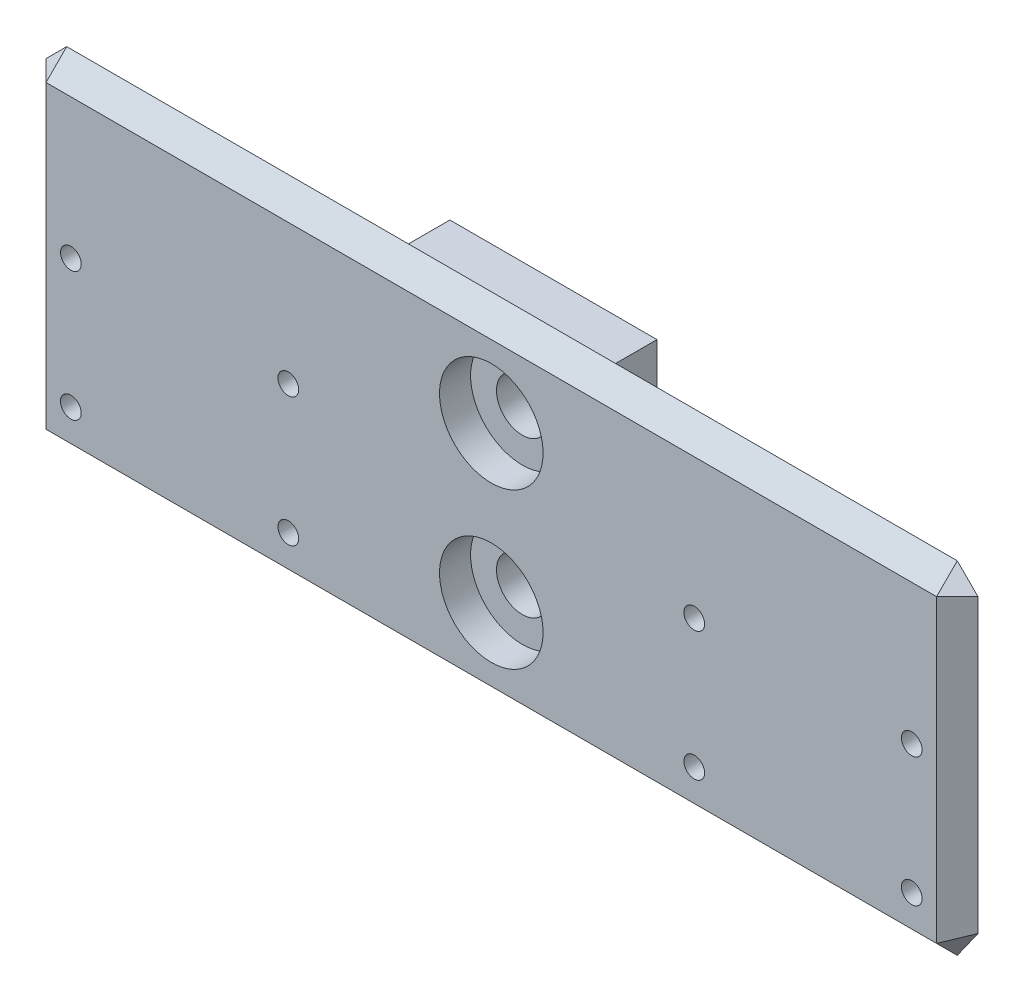
ISO-10303-21;
HEADER;
FILE_DESCRIPTION(('STEP AP214'),'2;1');
FILE_NAME('part.step','',(''),(''),'','','');
FILE_SCHEMA(('AUTOMOTIVE_DESIGN { 1 0 10303 214 1 1 1 1 }'));
ENDSEC;
DATA;
#1=APPLICATION_CONTEXT('core data for automotive mechanical design processes');
#2=APPLICATION_PROTOCOL_DEFINITION('international standard','automotive_design',2000,#1);
#3=PRODUCT_CONTEXT('',#1,'mechanical');
#4=PRODUCT('Part','Part','',(#3));
#5=PRODUCT_RELATED_PRODUCT_CATEGORY('part','',(#4));
#6=PRODUCT_DEFINITION_FORMATION('','',#4);
#7=PRODUCT_DEFINITION_CONTEXT('part definition',#1,'design');
#8=PRODUCT_DEFINITION('design','',#6,#7);
#9=PRODUCT_DEFINITION_SHAPE('','',#8);
#10=(LENGTH_UNIT() NAMED_UNIT(*) SI_UNIT(.MILLI.,.METRE.));
#11=(NAMED_UNIT(*) PLANE_ANGLE_UNIT() SI_UNIT($,.RADIAN.));
#12=(NAMED_UNIT(*) SI_UNIT($,.STERADIAN.) SOLID_ANGLE_UNIT());
#13=UNCERTAINTY_MEASURE_WITH_UNIT(LENGTH_MEASURE(1.E-05),#10,'distance_accuracy_value','');
#14=(GEOMETRIC_REPRESENTATION_CONTEXT(3) GLOBAL_UNCERTAINTY_ASSIGNED_CONTEXT((#13)) GLOBAL_UNIT_ASSIGNED_CONTEXT((#10,
#11,#12)) REPRESENTATION_CONTEXT('',''));
#15=CARTESIAN_POINT('',(0.,0.,0.));
#16=DIRECTION('',(0.,0.,1.));
#17=DIRECTION('',(1.,0.,0.));
#18=AXIS2_PLACEMENT_3D('',#15,#16,#17);
#19=CARTESIAN_POINT('',(0.,0.,0.));
#20=DIRECTION('',(0.,0.,1.));
#21=DIRECTION('',(1.,0.,0.));
#22=AXIS2_PLACEMENT_3D('',#19,#20,#21);
#23=PLANE('',#22);
#24=CARTESIAN_POINT('',(66.2948784786443,53.9939288049631,0.));
#25=DIRECTION('',(0.,0.,1.));
#26=DIRECTION('',(1.,0.,0.));
#27=AXIS2_PLACEMENT_3D('',#24,#25,#26);
#28=CIRCLE('',#27,0.999999999999998);
#29=CARTESIAN_POINT('',(67.2948784786443,53.9939288049631,0.));
#30=VERTEX_POINT('',#29);
#31=EDGE_CURVE('E223',#30,#30,#28,.F.);
#32=ORIENTED_EDGE('',*,*,#31,.F.);
#33=EDGE_LOOP('',(#32));
#34=FACE_BOUND('',#33,.T.);
#35=CARTESIAN_POINT('',(45.2948784786443,41.5439288049631,0.));
#36=DIRECTION('',(0.,0.,1.));
#37=DIRECTION('',(1.,0.,0.));
#38=AXIS2_PLACEMENT_3D('',#35,#36,#37);
#39=CIRCLE('',#38,0.999999999999998);
#40=CARTESIAN_POINT('',(46.2948784786443,41.5439288049631,0.));
#41=VERTEX_POINT('',#40);
#42=EDGE_CURVE('E224',#41,#41,#39,.F.);
#43=ORIENTED_EDGE('',*,*,#42,.F.);
#44=EDGE_LOOP('',(#43));
#45=FACE_BOUND('',#44,.T.);
#46=CARTESIAN_POINT('',(45.2948784786443,53.9939288049631,0.));
#47=DIRECTION('',(0.,0.,1.));
#48=DIRECTION('',(1.,0.,0.));
#49=AXIS2_PLACEMENT_3D('',#46,#47,#48);
#50=CIRCLE('',#49,0.999999999999998);
#51=CARTESIAN_POINT('',(46.2948784786443,53.9939288049631,0.));
#52=VERTEX_POINT('',#51);
#53=EDGE_CURVE('E216',#52,#52,#50,.F.);
#54=ORIENTED_EDGE('',*,*,#53,.F.);
#55=EDGE_LOOP('',(#54));
#56=FACE_BOUND('',#55,.T.);
#57=CARTESIAN_POINT('',(66.2948784786443,41.5439288049631,0.));
#58=DIRECTION('',(0.,0.,1.));
#59=DIRECTION('',(1.,0.,0.));
#60=AXIS2_PLACEMENT_3D('',#57,#58,#59);
#61=CIRCLE('',#60,0.999999999999998);
#62=CARTESIAN_POINT('',(67.2948784786443,41.5439288049631,0.));
#63=VERTEX_POINT('',#62);
#64=EDGE_CURVE('E234',#63,#63,#61,.F.);
#65=ORIENTED_EDGE('',*,*,#64,.F.);
#66=EDGE_LOOP('',(#65));
#67=FACE_BOUND('',#66,.T.);
#68=DIRECTION('',(0.577350269189623,0.816496580927728,0.));
#69=VECTOR('',#68,1.);
#70=CARTESIAN_POINT('',(28.5931826323442,-20.2184333350358,0.));
#71=LINE('',#70,#69);
#72=CARTESIAN_POINT('',(68.6948784786442,36.4939288049629,0.));
#73=VERTEX_POINT('',#72);
#74=CARTESIAN_POINT('',(70.6948784786443,39.3223559297093,0.));
#75=VERTEX_POINT('',#74);
#76=EDGE_CURVE('E241',#73,#75,#71,.T.);
#77=ORIENTED_EDGE('',*,*,#76,.F.);
#78=DIRECTION('',(1.,0.,0.));
#79=VECTOR('',#78,1.);
#80=CARTESIAN_POINT('',(-19.3051215213557,36.4939288049629,0.));
#81=LINE('',#80,#79);
#82=CARTESIAN_POINT('',(35.6948784786443,36.4939288049629,0.));
#83=VERTEX_POINT('',#82);
#84=EDGE_CURVE('E303',#83,#73,#81,.T.);
#85=ORIENTED_EDGE('',*,*,#84,.F.);
#86=DIRECTION('',(0.,-1.,0.));
#87=VECTOR('',#86,1.);
#88=CARTESIAN_POINT('',(35.6948784786443,36.493928804963,0.));
#89=LINE('',#88,#87);
#90=CARTESIAN_POINT('',(35.6948784786443,69.493928804963,0.));
#91=VERTEX_POINT('',#90);
#92=EDGE_CURVE('E279',#91,#83,#89,.T.);
#93=ORIENTED_EDGE('',*,*,#92,.F.);
#94=DIRECTION('',(1.,0.,0.));
#95=VECTOR('',#94,1.);
#96=CARTESIAN_POINT('',(-19.3051215213557,69.493928804963,0.));
#97=LINE('',#96,#95);
#98=CARTESIAN_POINT('',(68.6948784786443,69.493928804963,0.));
#99=VERTEX_POINT('',#98);
#100=EDGE_CURVE('E309',#91,#99,#97,.T.);
#101=ORIENTED_EDGE('',*,*,#100,.T.);
#102=DIRECTION('',(-0.707106781186552,0.707106781186543,0.));
#103=VECTOR('',#102,1.);
#104=CARTESIAN_POINT('',(68.6948784786443,69.493928804963,0.));
#105=LINE('',#104,#103);
#106=CARTESIAN_POINT('',(70.6948784786443,67.493928804963,0.));
#107=VERTEX_POINT('',#106);
#108=EDGE_CURVE('E326',#99,#107,#105,.F.);
#109=ORIENTED_EDGE('',*,*,#108,.T.);
#110=DIRECTION('',(0.,-1.,0.));
#111=VECTOR('',#110,1.);
#112=CARTESIAN_POINT('',(70.6948784786443,69.493928804963,0.));
#113=LINE('',#112,#111);
#114=EDGE_CURVE('E306',#107,#75,#113,.T.);
#115=ORIENTED_EDGE('',*,*,#114,.T.);
#116=EDGE_LOOP('',(#77,#85,#93,#101,#109,#115));
#117=FACE_BOUND('',#116,.T.);
#118=ADVANCED_FACE('F32',(#34,#45,#56,#67,#117),#23,.F.);
#119=CARTESIAN_POINT('',(-14.9051215213557,53.9939288049631,0.));
#120=DIRECTION('',(0.,0.,1.));
#121=DIRECTION('',(1.,0.,0.));
#122=AXIS2_PLACEMENT_3D('',#119,#120,#121);
#123=CIRCLE('',#122,0.999999999999998);
#124=CARTESIAN_POINT('',(-13.9051215213557,53.9939288049631,0.));
#125=VERTEX_POINT('',#124);
#126=EDGE_CURVE('E409',#125,#125,#123,.T.);
#127=ORIENTED_EDGE('',*,*,#126,.T.);
#128=EDGE_LOOP('',(#127));
#129=FACE_BOUND('',#128,.T.);
#130=CARTESIAN_POINT('',(6.09487847864432,41.5439288049631,0.));
#131=DIRECTION('',(0.,0.,1.));
#132=DIRECTION('',(1.,0.,0.));
#133=AXIS2_PLACEMENT_3D('',#130,#131,#132);
#134=CIRCLE('',#133,0.999999999999998);
#135=CARTESIAN_POINT('',(7.09487847864432,41.5439288049631,0.));
#136=VERTEX_POINT('',#135);
#137=EDGE_CURVE('E402',#136,#136,#134,.T.);
#138=ORIENTED_EDGE('',*,*,#137,.T.);
#139=EDGE_LOOP('',(#138));
#140=FACE_BOUND('',#139,.T.);
#141=CARTESIAN_POINT('',(6.09487847864433,53.9939288049631,0.));
#142=DIRECTION('',(0.,0.,1.));
#143=DIRECTION('',(1.,0.,0.));
#144=AXIS2_PLACEMENT_3D('',#141,#142,#143);
#145=CIRCLE('',#144,0.999999999999998);
#146=CARTESIAN_POINT('',(7.09487847864433,53.9939288049631,0.));
#147=VERTEX_POINT('',#146);
#148=EDGE_CURVE('E414',#147,#147,#145,.T.);
#149=ORIENTED_EDGE('',*,*,#148,.T.);
#150=EDGE_LOOP('',(#149));
#151=FACE_BOUND('',#150,.T.);
#152=CARTESIAN_POINT('',(-14.9051215213557,41.5439288049631,0.));
#153=DIRECTION('',(0.,0.,1.));
#154=DIRECTION('',(1.,0.,0.));
#155=AXIS2_PLACEMENT_3D('',#152,#153,#154);
#156=CIRCLE('',#155,0.999999999999998);
#157=CARTESIAN_POINT('',(-13.9051215213557,41.5439288049631,0.));
#158=VERTEX_POINT('',#157);
#159=EDGE_CURVE('E393',#158,#158,#156,.T.);
#160=ORIENTED_EDGE('',*,*,#159,.T.);
#161=EDGE_LOOP('',(#160));
#162=FACE_BOUND('',#161,.T.);
#163=DIRECTION('',(0.577350269189627,-0.816496580927726,0.));
#164=VECTOR('',#163,1.);
#165=CARTESIAN_POINT('',(5.66665533918183,4.00693041698243,0.));
#166=LINE('',#165,#164);
#167=CARTESIAN_POINT('',(-19.3051215213557,39.3223559297091,0.));
#168=VERTEX_POINT('',#167);
#169=CARTESIAN_POINT('',(-17.3051215213557,36.4939288049629,0.));
#170=VERTEX_POINT('',#169);
#171=EDGE_CURVE('E244',#168,#170,#166,.T.);
#172=ORIENTED_EDGE('',*,*,#171,.F.);
#173=DIRECTION('',(0.,-1.,0.));
#174=VECTOR('',#173,1.);
#175=CARTESIAN_POINT('',(-19.3051215213557,69.493928804963,0.));
#176=LINE('',#175,#174);
#177=CARTESIAN_POINT('',(-19.3051215213557,67.493928804963,0.));
#178=VERTEX_POINT('',#177);
#179=EDGE_CURVE('E277',#178,#168,#176,.T.);
#180=ORIENTED_EDGE('',*,*,#179,.F.);
#181=DIRECTION('',(0.707106781186552,0.707106781186543,0.));
#182=VECTOR('',#181,1.);
#183=CARTESIAN_POINT('',(-19.3051215213557,67.493928804963,0.));
#184=LINE('',#183,#182);
#185=CARTESIAN_POINT('',(-17.3051215213557,69.493928804963,0.));
#186=VERTEX_POINT('',#185);
#187=EDGE_CURVE('E331',#178,#186,#184,.T.);
#188=ORIENTED_EDGE('',*,*,#187,.T.);
#189=CARTESIAN_POINT('',(15.6948784786443,69.493928804963,0.));
#190=VERTEX_POINT('',#189);
#191=EDGE_CURVE('E310',#186,#190,#97,.T.);
#192=ORIENTED_EDGE('',*,*,#191,.T.);
#193=DIRECTION('',(0.,1.,0.));
#194=VECTOR('',#193,1.);
#195=CARTESIAN_POINT('',(15.6948784786443,36.493928804963,0.));
#196=LINE('',#195,#194);
#197=CARTESIAN_POINT('',(15.6948784786443,36.4939288049629,0.));
#198=VERTEX_POINT('',#197);
#199=EDGE_CURVE('E282',#198,#190,#196,.T.);
#200=ORIENTED_EDGE('',*,*,#199,.F.);
#201=EDGE_CURVE('E304',#170,#198,#81,.T.);
#202=ORIENTED_EDGE('',*,*,#201,.F.);
#203=EDGE_LOOP('',(#172,#180,#188,#192,#200,#202));
#204=FACE_BOUND('',#203,.T.);
#205=ADVANCED_FACE('F378',(#129,#140,#151,#162,#204),#23,.F.);
#206=CARTESIAN_POINT('',(0.,38.4939288049629,2.));
#207=DIRECTION('',(0.,-0.707106781186552,0.707106781186542));
#208=DIRECTION('',(-1.,0.,0.));
#209=AXIS2_PLACEMENT_3D('',#206,#207,#208);
#210=PLANE('',#209);
#211=DIRECTION('',(1.,0.,0.));
#212=VECTOR('',#211,1.);
#213=CARTESIAN_POINT('',(70.6948784786443,38.4939288049629,2.));
#214=LINE('',#213,#212);
#215=CARTESIAN_POINT('',(-17.3051215213557,38.4939288049629,2.));
#216=VERTEX_POINT('',#215);
#217=CARTESIAN_POINT('',(68.6948784786442,38.493928804963,2.00000000000006));
#218=VERTEX_POINT('',#217);
#219=EDGE_CURVE('E318',#216,#218,#214,.T.);
#220=ORIENTED_EDGE('',*,*,#219,.F.);
#221=DIRECTION('',(0.,-0.707106781186548,-0.707106781186548));
#222=VECTOR('',#221,1.);
#223=CARTESIAN_POINT('',(-17.3051215213557,53.993928804963,17.5000000000001));
#224=LINE('',#223,#222);
#225=EDGE_CURVE('E238',#216,#170,#224,.T.);
#226=ORIENTED_EDGE('',*,*,#225,.T.);
#227=ORIENTED_EDGE('',*,*,#201,.T.);
#228=DIRECTION('',(-1.,0.,0.));
#229=VECTOR('',#228,1.);
#230=CARTESIAN_POINT('',(-19.3051215213557,36.4939288049629,0.));
#231=LINE('',#230,#229);
#232=EDGE_CURVE('E328',#83,#198,#231,.T.);
#233=ORIENTED_EDGE('',*,*,#232,.F.);
#234=ORIENTED_EDGE('',*,*,#84,.T.);
#235=DIRECTION('',(0.,-0.707106781186548,-0.707106781186548));
#236=VECTOR('',#235,1.);
#237=CARTESIAN_POINT('',(68.6948784786442,53.9939288049631,17.5000000000001));
#238=LINE('',#237,#236);
#239=EDGE_CURVE('E237',#218,#73,#238,.T.);
#240=ORIENTED_EDGE('',*,*,#239,.F.);
#241=EDGE_LOOP('',(#220,#226,#227,#233,#234,#240));
#242=FACE_BOUND('',#241,.T.);
#243=ADVANCED_FACE('F34',(#242),#210,.T.);
#244=CARTESIAN_POINT('',(-17.3051215213557,0.,2.));
#245=DIRECTION('',(-0.707106781186543,0.,0.707106781186552));
#246=DIRECTION('',(0.,1.,0.));
#247=AXIS2_PLACEMENT_3D('',#244,#245,#246);
#248=PLANE('',#247);
#249=ORIENTED_EDGE('',*,*,#179,.T.);
#250=DIRECTION('',(0.67859834454585,-0.28108463771483,0.67859834454584));
#251=VECTOR('',#250,1.);
#252=CARTESIAN_POINT('',(-9.96265212429387,35.4525783993904,9.3424693970617));
#253=LINE('',#252,#251);
#254=EDGE_CURVE('E349',#168,#216,#253,.T.);
#255=ORIENTED_EDGE('',*,*,#254,.T.);
#256=DIRECTION('',(0.,-1.,0.));
#257=VECTOR('',#256,1.);
#258=CARTESIAN_POINT('',(-17.3051215213557,36.4939288049629,2.));
#259=LINE('',#258,#257);
#260=CARTESIAN_POINT('',(-17.3051215213557,67.493928804963,2.));
#261=VERTEX_POINT('',#260);
#262=EDGE_CURVE('E315',#261,#216,#259,.T.);
#263=ORIENTED_EDGE('',*,*,#262,.F.);
#264=DIRECTION('',(0.707106781186552,0.,0.707106781186543));
#265=VECTOR('',#264,1.);
#266=CARTESIAN_POINT('',(-17.3051215213557,67.493928804963,2.));
#267=LINE('',#266,#265);
#268=EDGE_CURVE('E283',#178,#261,#267,.T.);
#269=ORIENTED_EDGE('',*,*,#268,.F.);
#270=EDGE_LOOP('',(#249,#255,#263,#269));
#271=FACE_BOUND('',#270,.T.);
#272=ADVANCED_FACE('F476',(#271),#248,.T.);
#273=CARTESIAN_POINT('',(70.6948784786443,69.493928804963,0.));
#274=DIRECTION('',(-0.707106781186542,0.,-0.707106781186552));
#275=DIRECTION('',(0.,-1.,0.));
#276=AXIS2_PLACEMENT_3D('',#273,#274,#275);
#277=PLANE('',#276);
#278=DIRECTION('',(0.,1.,0.));
#279=VECTOR('',#278,1.);
#280=CARTESIAN_POINT('',(68.6948784786443,0.,2.));
#281=LINE('',#280,#279);
#282=CARTESIAN_POINT('',(68.6948784786443,67.493928804963,2.));
#283=VERTEX_POINT('',#282);
#284=EDGE_CURVE('E321',#218,#283,#281,.T.);
#285=ORIENTED_EDGE('',*,*,#284,.F.);
#286=DIRECTION('',(-0.678598344545848,-0.281084637714837,0.678598344545839));
#287=VECTOR('',#286,1.);
#288=CARTESIAN_POINT('',(76.449911996273,41.706168864623,-5.75503351762865));
#289=LINE('',#288,#287);
#290=EDGE_CURVE('E333',#218,#75,#289,.F.);
#291=ORIENTED_EDGE('',*,*,#290,.T.);
#292=ORIENTED_EDGE('',*,*,#114,.F.);
#293=DIRECTION('',(-0.707106781186552,0.,0.707106781186543));
#294=VECTOR('',#293,1.);
#295=CARTESIAN_POINT('',(69.6948784786443,67.493928804963,0.999999999999999));
#296=LINE('',#295,#294);
#297=EDGE_CURVE('E338',#283,#107,#296,.F.);
#298=ORIENTED_EDGE('',*,*,#297,.F.);
#299=EDGE_LOOP('',(#285,#291,#292,#298));
#300=FACE_BOUND('',#299,.T.);
#301=ADVANCED_FACE('F473',(#300),#277,.F.);
#302=CARTESIAN_POINT('',(25.6948784786443,60.493928804963,-3.99999999999998));
#303=DIRECTION('',(0.,0.,1.));
#304=DIRECTION('',(1.,0.,0.));
#305=AXIS2_PLACEMENT_3D('',#302,#303,#304);
#306=CYLINDRICAL_SURFACE('',#305,2.5);
#307=CARTESIAN_POINT('',(25.6948784786443,60.493928804963,-3.99999999999998));
#308=DIRECTION('',(0.,0.,1.));
#309=DIRECTION('',(1.,0.,0.));
#310=AXIS2_PLACEMENT_3D('',#307,#308,#309);
#311=CIRCLE('',#310,2.5);
#312=CARTESIAN_POINT('',(28.1948784786443,60.493928804963,-3.99999999999998));
#313=VERTEX_POINT('',#312);
#314=EDGE_CURVE('E263',#313,#313,#311,.T.);
#315=ORIENTED_EDGE('',*,*,#314,.F.);
#316=EDGE_LOOP('',(#315));
#317=FACE_BOUND('',#316,.T.);
#318=CARTESIAN_POINT('',(25.6948784786443,60.493928804963,-1.));
#319=DIRECTION('',(0.,0.,1.));
#320=DIRECTION('',(1.,0.,0.));
#321=AXIS2_PLACEMENT_3D('',#318,#319,#320);
#322=CIRCLE('',#321,2.5);
#323=CARTESIAN_POINT('',(28.1948784786443,60.493928804963,-1.));
#324=VERTEX_POINT('',#323);
#325=EDGE_CURVE('E266',#324,#324,#322,.F.);
#326=ORIENTED_EDGE('',*,*,#325,.F.);
#327=EDGE_LOOP('',(#326));
#328=FACE_BOUND('',#327,.T.);
#329=ADVANCED_FACE('F475',(#317,#328),#306,.F.);
#330=CARTESIAN_POINT('',(25.6948784786443,45.493928804963,-3.99999999999998));
#331=DIRECTION('',(0.,0.,1.));
#332=DIRECTION('',(1.,0.,0.));
#333=AXIS2_PLACEMENT_3D('',#330,#331,#332);
#334=CYLINDRICAL_SURFACE('',#333,2.5);
#335=CARTESIAN_POINT('',(25.6948784786443,45.493928804963,-3.99999999999998));
#336=DIRECTION('',(0.,0.,1.));
#337=DIRECTION('',(1.,0.,0.));
#338=AXIS2_PLACEMENT_3D('',#335,#336,#337);
#339=CIRCLE('',#338,2.5);
#340=CARTESIAN_POINT('',(28.1948784786443,45.493928804963,-3.99999999999998));
#341=VERTEX_POINT('',#340);
#342=EDGE_CURVE('E259',#341,#341,#339,.T.);
#343=ORIENTED_EDGE('',*,*,#342,.F.);
#344=EDGE_LOOP('',(#343));
#345=FACE_BOUND('',#344,.T.);
#346=CARTESIAN_POINT('',(25.6948784786443,45.493928804963,-1.));
#347=DIRECTION('',(0.,0.,1.));
#348=DIRECTION('',(1.,0.,0.));
#349=AXIS2_PLACEMENT_3D('',#346,#347,#348);
#350=CIRCLE('',#349,2.5);
#351=CARTESIAN_POINT('',(28.1948784786443,45.493928804963,-1.));
#352=VERTEX_POINT('',#351);
#353=EDGE_CURVE('E250',#352,#352,#350,.F.);
#354=ORIENTED_EDGE('',*,*,#353,.F.);
#355=EDGE_LOOP('',(#354));
#356=FACE_BOUND('',#355,.T.);
#357=ADVANCED_FACE('F460',(#345,#356),#334,.F.);
#358=CARTESIAN_POINT('',(-19.3051215213557,36.4939288049629,2.));
#359=DIRECTION('',(0.,1.,0.));
#360=DIRECTION('',(0.,0.,1.));
#361=AXIS2_PLACEMENT_3D('',#358,#359,#360);
#362=PLANE('',#361);
#363=DIRECTION('',(0.,0.,1.));
#364=VECTOR('',#363,1.);
#365=CARTESIAN_POINT('',(35.6948784786443,36.493928804963,-42.5875627631495));
#366=LINE('',#365,#364);
#367=CARTESIAN_POINT('',(35.6948784786443,36.493928804963,-3.99999999999998));
#368=VERTEX_POINT('',#367);
#369=EDGE_CURVE('E295',#368,#83,#366,.T.);
#370=ORIENTED_EDGE('',*,*,#369,.T.);
#371=ORIENTED_EDGE('',*,*,#232,.T.);
#372=DIRECTION('',(0.,0.,1.));
#373=VECTOR('',#372,1.);
#374=CARTESIAN_POINT('',(15.6948784786443,36.493928804963,-42.5875627631495));
#375=LINE('',#374,#373);
#376=CARTESIAN_POINT('',(15.6948784786443,36.493928804963,-3.99999999999998));
#377=VERTEX_POINT('',#376);
#378=EDGE_CURVE('E292',#377,#198,#375,.T.);
#379=ORIENTED_EDGE('',*,*,#378,.F.);
#380=DIRECTION('',(1.,0.,0.));
#381=VECTOR('',#380,1.);
#382=CARTESIAN_POINT('',(35.6948784786443,36.493928804963,-3.99999999999998));
#383=LINE('',#382,#381);
#384=EDGE_CURVE('E268',#377,#368,#383,.T.);
#385=ORIENTED_EDGE('',*,*,#384,.T.);
#386=EDGE_LOOP('',(#370,#371,#379,#385));
#387=FACE_BOUND('',#386,.T.);
#388=ADVANCED_FACE('F375',(#387),#362,.F.);
#389=CARTESIAN_POINT('',(-19.3051215213557,69.493928804963,2.));
#390=DIRECTION('',(0.,1.,0.));
#391=DIRECTION('',(0.,0.,1.));
#392=AXIS2_PLACEMENT_3D('',#389,#390,#391);
#393=PLANE('',#392);
#394=DIRECTION('',(0.,0.,1.));
#395=VECTOR('',#394,1.);
#396=CARTESIAN_POINT('',(15.6948784786443,69.493928804963,-42.5875627631495));
#397=LINE('',#396,#395);
#398=CARTESIAN_POINT('',(15.6948784786443,69.493928804963,-3.99999999999998));
#399=VERTEX_POINT('',#398);
#400=EDGE_CURVE('E289',#399,#190,#397,.T.);
#401=ORIENTED_EDGE('',*,*,#400,.T.);
#402=DIRECTION('',(1.,0.,0.));
#403=VECTOR('',#402,1.);
#404=CARTESIAN_POINT('',(-19.3051215213557,69.493928804963,0.));
#405=LINE('',#404,#403);
#406=EDGE_CURVE('E313',#190,#91,#405,.T.);
#407=ORIENTED_EDGE('',*,*,#406,.T.);
#408=DIRECTION('',(0.,0.,1.));
#409=VECTOR('',#408,1.);
#410=CARTESIAN_POINT('',(35.6948784786443,69.4939288049631,-42.5875627631495));
#411=LINE('',#410,#409);
#412=CARTESIAN_POINT('',(35.6948784786443,69.4939288049631,-3.99999999999998));
#413=VERTEX_POINT('',#412);
#414=EDGE_CURVE('E286',#413,#91,#411,.T.);
#415=ORIENTED_EDGE('',*,*,#414,.F.);
#416=DIRECTION('',(-1.,0.,0.));
#417=VECTOR('',#416,1.);
#418=CARTESIAN_POINT('',(35.6948784786443,69.4939288049631,-3.99999999999998));
#419=LINE('',#418,#417);
#420=EDGE_CURVE('E298',#413,#399,#419,.T.);
#421=ORIENTED_EDGE('',*,*,#420,.T.);
#422=EDGE_LOOP('',(#401,#407,#415,#421));
#423=FACE_BOUND('',#422,.T.);
#424=ADVANCED_FACE('F358',(#423),#393,.T.);
#425=CARTESIAN_POINT('',(0.,0.,2.));
#426=DIRECTION('',(0.,0.,1.));
#427=DIRECTION('',(1.,0.,0.));
#428=AXIS2_PLACEMENT_3D('',#425,#426,#427);
#429=PLANE('',#428);
#430=CARTESIAN_POINT('',(-14.9051215213557,53.9939288049631,2.));
#431=DIRECTION('',(0.,0.,-1.));
#432=DIRECTION('',(-1.,0.,0.));
#433=AXIS2_PLACEMENT_3D('',#430,#431,#432);
#434=CIRCLE('',#433,0.999999999999998);
#435=CARTESIAN_POINT('',(-15.9051215213557,53.9939288049631,2.));
#436=VERTEX_POINT('',#435);
#437=EDGE_CURVE('E400',#436,#436,#434,.T.);
#438=ORIENTED_EDGE('',*,*,#437,.T.);
#439=EDGE_LOOP('',(#438));
#440=FACE_BOUND('',#439,.T.);
#441=CARTESIAN_POINT('',(6.09487847864432,41.5439288049631,2.));
#442=DIRECTION('',(0.,0.,-1.));
#443=DIRECTION('',(-1.,0.,0.));
#444=AXIS2_PLACEMENT_3D('',#441,#442,#443);
#445=CIRCLE('',#444,0.999999999999998);
#446=CARTESIAN_POINT('',(5.09487847864433,41.5439288049631,2.));
#447=VERTEX_POINT('',#446);
#448=EDGE_CURVE('E405',#447,#447,#445,.T.);
#449=ORIENTED_EDGE('',*,*,#448,.T.);
#450=EDGE_LOOP('',(#449));
#451=FACE_BOUND('',#450,.T.);
#452=CARTESIAN_POINT('',(6.09487847864433,53.9939288049631,2.));
#453=DIRECTION('',(0.,0.,-1.));
#454=DIRECTION('',(-1.,0.,0.));
#455=AXIS2_PLACEMENT_3D('',#452,#453,#454);
#456=CIRCLE('',#455,0.999999999999998);
#457=CARTESIAN_POINT('',(5.09487847864433,53.9939288049631,2.));
#458=VERTEX_POINT('',#457);
#459=EDGE_CURVE('E406',#458,#458,#456,.T.);
#460=ORIENTED_EDGE('',*,*,#459,.T.);
#461=EDGE_LOOP('',(#460));
#462=FACE_BOUND('',#461,.T.);
#463=CARTESIAN_POINT('',(-14.9051215213557,41.5439288049631,2.));
#464=DIRECTION('',(0.,0.,-1.));
#465=DIRECTION('',(-1.,0.,0.));
#466=AXIS2_PLACEMENT_3D('',#463,#464,#465);
#467=CIRCLE('',#466,0.999999999999998);
#468=CARTESIAN_POINT('',(-15.9051215213557,41.5439288049631,2.));
#469=VERTEX_POINT('',#468);
#470=EDGE_CURVE('E388',#469,#469,#467,.T.);
#471=ORIENTED_EDGE('',*,*,#470,.T.);
#472=EDGE_LOOP('',(#471));
#473=FACE_BOUND('',#472,.T.);
#474=CARTESIAN_POINT('',(66.2948784786443,53.9939288049631,2.));
#475=DIRECTION('',(0.,0.,1.));
#476=DIRECTION('',(1.,0.,0.));
#477=AXIS2_PLACEMENT_3D('',#474,#475,#476);
#478=CIRCLE('',#477,0.999999999999998);
#479=CARTESIAN_POINT('',(67.2948784786443,53.9939288049631,2.));
#480=VERTEX_POINT('',#479);
#481=EDGE_CURVE('E220',#480,#480,#478,.T.);
#482=ORIENTED_EDGE('',*,*,#481,.F.);
#483=EDGE_LOOP('',(#482));
#484=FACE_BOUND('',#483,.T.);
#485=CARTESIAN_POINT('',(45.2948784786443,41.5439288049631,2.));
#486=DIRECTION('',(0.,0.,1.));
#487=DIRECTION('',(1.,0.,0.));
#488=AXIS2_PLACEMENT_3D('',#485,#486,#487);
#489=CIRCLE('',#488,0.999999999999998);
#490=CARTESIAN_POINT('',(46.2948784786443,41.5439288049631,2.));
#491=VERTEX_POINT('',#490);
#492=EDGE_CURVE('E219',#491,#491,#489,.T.);
#493=ORIENTED_EDGE('',*,*,#492,.F.);
#494=EDGE_LOOP('',(#493));
#495=FACE_BOUND('',#494,.T.);
#496=CARTESIAN_POINT('',(45.2948784786443,53.9939288049631,2.));
#497=DIRECTION('',(0.,0.,1.));
#498=DIRECTION('',(1.,0.,0.));
#499=AXIS2_PLACEMENT_3D('',#496,#497,#498);
#500=CIRCLE('',#499,0.999999999999998);
#501=CARTESIAN_POINT('',(46.2948784786443,53.9939288049631,2.));
#502=VERTEX_POINT('',#501);
#503=EDGE_CURVE('E213',#502,#502,#500,.T.);
#504=ORIENTED_EDGE('',*,*,#503,.F.);
#505=EDGE_LOOP('',(#504));
#506=FACE_BOUND('',#505,.T.);
#507=CARTESIAN_POINT('',(66.2948784786443,41.5439288049631,2.));
#508=DIRECTION('',(0.,0.,1.));
#509=DIRECTION('',(1.,0.,0.));
#510=AXIS2_PLACEMENT_3D('',#507,#508,#509);
#511=CIRCLE('',#510,0.999999999999998);
#512=CARTESIAN_POINT('',(67.2948784786443,41.5439288049631,2.));
#513=VERTEX_POINT('',#512);
#514=EDGE_CURVE('E227',#513,#513,#511,.T.);
#515=ORIENTED_EDGE('',*,*,#514,.F.);
#516=EDGE_LOOP('',(#515));
#517=FACE_BOUND('',#516,.T.);
#518=CARTESIAN_POINT('',(25.6948784786443,60.493928804963,2.));
#519=DIRECTION('',(0.,0.,1.));
#520=DIRECTION('',(1.,0.,0.));
#521=AXIS2_PLACEMENT_3D('',#518,#519,#520);
#522=CIRCLE('',#521,5.);
#523=CARTESIAN_POINT('',(30.6948784786443,60.493928804963,2.));
#524=VERTEX_POINT('',#523);
#525=EDGE_CURVE('E251',#524,#524,#522,.T.);
#526=ORIENTED_EDGE('',*,*,#525,.F.);
#527=EDGE_LOOP('',(#526));
#528=FACE_BOUND('',#527,.T.);
#529=CARTESIAN_POINT('',(25.6948784786443,45.493928804963,2.));
#530=DIRECTION('',(0.,0.,1.));
#531=DIRECTION('',(1.,0.,0.));
#532=AXIS2_PLACEMENT_3D('',#529,#530,#531);
#533=CIRCLE('',#532,5.);
#534=CARTESIAN_POINT('',(30.6948784786443,45.493928804963,2.));
#535=VERTEX_POINT('',#534);
#536=EDGE_CURVE('E246',#535,#535,#533,.T.);
#537=ORIENTED_EDGE('',*,*,#536,.F.);
#538=EDGE_LOOP('',(#537));
#539=FACE_BOUND('',#538,.T.);
#540=ORIENTED_EDGE('',*,*,#284,.T.);
#541=DIRECTION('',(-1.,0.,0.));
#542=VECTOR('',#541,1.);
#543=CARTESIAN_POINT('',(0.,67.493928804963,2.));
#544=LINE('',#543,#542);
#545=EDGE_CURVE('E323',#283,#261,#544,.T.);
#546=ORIENTED_EDGE('',*,*,#545,.T.);
#547=ORIENTED_EDGE('',*,*,#262,.T.);
#548=ORIENTED_EDGE('',*,*,#219,.T.);
#549=EDGE_LOOP('',(#540,#546,#547,#548));
#550=FACE_BOUND('',#549,.T.);
#551=ADVANCED_FACE('F420',(#440,#451,#462,#473,#484,#495,#506,#517,#528,#539,#550),#429,.T.);
#552=CARTESIAN_POINT('',(15.6948784786443,36.493928804963,-42.5875627631495));
#553=DIRECTION('',(1.,0.,0.));
#554=DIRECTION('',(0.,0.,-1.));
#555=AXIS2_PLACEMENT_3D('',#552,#553,#554);
#556=PLANE('',#555);
#557=DIRECTION('',(0.,1.,0.));
#558=VECTOR('',#557,1.);
#559=CARTESIAN_POINT('',(15.6948784786443,36.493928804963,-0.999999999999973));
#560=LINE('',#559,#558);
#561=CARTESIAN_POINT('',(15.6948784786443,40.6237945190245,-0.999999999999976));
#562=VERTEX_POINT('',#561);
#563=CARTESIAN_POINT('',(15.6948784786443,45.1540630909015,-0.999999999999976));
#564=VERTEX_POINT('',#563);
#565=EDGE_CURVE('E11',#562,#564,#560,.T.);
#566=ORIENTED_EDGE('',*,*,#565,.F.);
#567=DIRECTION('',(0.,0.,-1.));
#568=VECTOR('',#567,1.);
#569=CARTESIAN_POINT('',(15.6948784786443,40.6237945190245,-0.999999999999976));
#570=LINE('',#569,#568);
#571=CARTESIAN_POINT('',(15.6948784786443,40.6237945190245,-3.99999999999998));
#572=VERTEX_POINT('',#571);
#573=EDGE_CURVE('E206',#562,#572,#570,.T.);
#574=ORIENTED_EDGE('',*,*,#573,.T.);
#575=DIRECTION('',(0.,-1.,0.));
#576=VECTOR('',#575,1.);
#577=CARTESIAN_POINT('',(15.6948784786443,36.493928804963,-3.99999999999998));
#578=LINE('',#577,#576);
#579=EDGE_CURVE('E270',#572,#377,#578,.T.);
#580=ORIENTED_EDGE('',*,*,#579,.T.);
#581=ORIENTED_EDGE('',*,*,#378,.T.);
#582=ORIENTED_EDGE('',*,*,#199,.T.);
#583=ORIENTED_EDGE('',*,*,#400,.F.);
#584=CARTESIAN_POINT('',(15.6948784786443,58.5540630909014,-3.99999999999998));
#585=VERTEX_POINT('',#584);
#586=EDGE_CURVE('E198',#399,#585,#578,.T.);
#587=ORIENTED_EDGE('',*,*,#586,.T.);
#588=DIRECTION('',(0.,0.,-1.));
#589=VECTOR('',#588,1.);
#590=CARTESIAN_POINT('',(15.6948784786443,58.5540630909014,-0.999999999999976));
#591=LINE('',#590,#589);
#592=CARTESIAN_POINT('',(15.6948784786443,58.5540630909014,-0.999999999999976));
#593=VERTEX_POINT('',#592);
#594=EDGE_CURVE('E164',#585,#593,#591,.F.);
#595=ORIENTED_EDGE('',*,*,#594,.T.);
#596=DIRECTION('',(0.,1.,0.));
#597=VECTOR('',#596,1.);
#598=CARTESIAN_POINT('',(15.6948784786443,36.493928804963,-0.999999999999973));
#599=LINE('',#598,#597);
#600=CARTESIAN_POINT('',(15.6948784786443,54.0237945190247,-0.999999999999976));
#601=VERTEX_POINT('',#600);
#602=EDGE_CURVE('E40',#601,#593,#599,.T.);
#603=ORIENTED_EDGE('',*,*,#602,.F.);
#604=DIRECTION('',(0.,0.,-1.));
#605=VECTOR('',#604,1.);
#606=CARTESIAN_POINT('',(15.6948784786443,54.0237945190247,-0.999999999999976));
#607=LINE('',#606,#605);
#608=CARTESIAN_POINT('',(15.6948784786443,54.0237945190247,-3.99999999999998));
#609=VERTEX_POINT('',#608);
#610=EDGE_CURVE('E191',#601,#609,#607,.T.);
#611=ORIENTED_EDGE('',*,*,#610,.T.);
#612=CARTESIAN_POINT('',(15.6948784786443,45.1540630909015,-3.99999999999998));
#613=VERTEX_POINT('',#612);
#614=EDGE_CURVE('E269',#609,#613,#578,.T.);
#615=ORIENTED_EDGE('',*,*,#614,.T.);
#616=DIRECTION('',(0.,0.,-1.));
#617=VECTOR('',#616,1.);
#618=CARTESIAN_POINT('',(15.6948784786443,45.1540630909015,-0.999999999999976));
#619=LINE('',#618,#617);
#620=EDGE_CURVE('E200',#613,#564,#619,.F.);
#621=ORIENTED_EDGE('',*,*,#620,.T.);
#622=EDGE_LOOP('',(#566,#574,#580,#581,#582,#583,#587,#595,#603,#611,#615,#621));
#623=FACE_BOUND('',#622,.T.);
#624=ADVANCED_FACE('F196',(#623),#556,.F.);
#625=CARTESIAN_POINT('',(35.6948784786443,36.493928804963,-42.5875627631495));
#626=DIRECTION('',(-1.,0.,0.));
#627=DIRECTION('',(0.,-1.,0.));
#628=AXIS2_PLACEMENT_3D('',#625,#626,#627);
#629=PLANE('',#628);
#630=DIRECTION('',(0.,-1.,0.));
#631=VECTOR('',#630,1.);
#632=CARTESIAN_POINT('',(35.6948784786443,36.493928804963,-0.999999999999973));
#633=LINE('',#632,#631);
#634=CARTESIAN_POINT('',(35.6948784786443,45.1540630909014,-0.999999999999976));
#635=VERTEX_POINT('',#634);
#636=CARTESIAN_POINT('',(35.6948784786443,40.6237945190247,-0.999999999999976));
#637=VERTEX_POINT('',#636);
#638=EDGE_CURVE('E174',#635,#637,#633,.T.);
#639=ORIENTED_EDGE('',*,*,#638,.F.);
#640=DIRECTION('',(0.,0.,-1.));
#641=VECTOR('',#640,1.);
#642=CARTESIAN_POINT('',(35.6948784786443,45.1540630909014,-0.999999999999976));
#643=LINE('',#642,#641);
#644=CARTESIAN_POINT('',(35.6948784786443,45.1540630909014,-3.99999999999998));
#645=VERTEX_POINT('',#644);
#646=EDGE_CURVE('E210',#635,#645,#643,.T.);
#647=ORIENTED_EDGE('',*,*,#646,.T.);
#648=DIRECTION('',(0.,1.,0.));
#649=VECTOR('',#648,1.);
#650=CARTESIAN_POINT('',(35.6948784786443,36.493928804963,-3.99999999999998));
#651=LINE('',#650,#649);
#652=CARTESIAN_POINT('',(35.6948784786443,54.0237945190247,-3.99999999999998));
#653=VERTEX_POINT('',#652);
#654=EDGE_CURVE('E278',#645,#653,#651,.T.);
#655=ORIENTED_EDGE('',*,*,#654,.T.);
#656=DIRECTION('',(0.,0.,-1.));
#657=VECTOR('',#656,1.);
#658=CARTESIAN_POINT('',(35.6948784786443,54.0237945190247,-0.999999999999976));
#659=LINE('',#658,#657);
#660=CARTESIAN_POINT('',(35.6948784786443,54.0237945190247,-0.999999999999976));
#661=VERTEX_POINT('',#660);
#662=EDGE_CURVE('E47',#653,#661,#659,.F.);
#663=ORIENTED_EDGE('',*,*,#662,.T.);
#664=DIRECTION('',(0.,-1.,0.));
#665=VECTOR('',#664,1.);
#666=CARTESIAN_POINT('',(35.6948784786443,36.493928804963,-0.999999999999973));
#667=LINE('',#666,#665);
#668=CARTESIAN_POINT('',(35.6948784786443,58.5540630909013,-0.999999999999976));
#669=VERTEX_POINT('',#668);
#670=EDGE_CURVE('E168',#669,#661,#667,.T.);
#671=ORIENTED_EDGE('',*,*,#670,.F.);
#672=DIRECTION('',(0.,0.,-1.));
#673=VECTOR('',#672,1.);
#674=CARTESIAN_POINT('',(35.6948784786443,58.5540630909013,-0.999999999999976));
#675=LINE('',#674,#673);
#676=CARTESIAN_POINT('',(35.6948784786443,58.5540630909013,-3.99999999999998));
#677=VERTEX_POINT('',#676);
#678=EDGE_CURVE('E156',#669,#677,#675,.T.);
#679=ORIENTED_EDGE('',*,*,#678,.T.);
#680=EDGE_CURVE('E273',#677,#413,#651,.T.);
#681=ORIENTED_EDGE('',*,*,#680,.T.);
#682=ORIENTED_EDGE('',*,*,#414,.T.);
#683=ORIENTED_EDGE('',*,*,#92,.T.);
#684=ORIENTED_EDGE('',*,*,#369,.F.);
#685=CARTESIAN_POINT('',(35.6948784786443,40.6237945190247,-3.99999999999998));
#686=VERTEX_POINT('',#685);
#687=EDGE_CURVE('E274',#368,#686,#651,.T.);
#688=ORIENTED_EDGE('',*,*,#687,.T.);
#689=DIRECTION('',(0.,0.,-1.));
#690=VECTOR('',#689,1.);
#691=CARTESIAN_POINT('',(35.6948784786443,40.6237945190247,-0.999999999999976));
#692=LINE('',#691,#690);
#693=EDGE_CURVE('E55',#686,#637,#692,.F.);
#694=ORIENTED_EDGE('',*,*,#693,.T.);
#695=EDGE_LOOP('',(#639,#647,#655,#663,#671,#679,#681,#682,#683,#684,#688,#694));
#696=FACE_BOUND('',#695,.T.);
#697=ADVANCED_FACE('F172',(#696),#629,.F.);
#698=CARTESIAN_POINT('',(25.6948784786443,14.4939288049631,-3.99999999999998));
#699=DIRECTION('',(0.,0.,1.));
#700=DIRECTION('',(1.,0.,0.));
#701=AXIS2_PLACEMENT_3D('',#698,#699,#700);
#702=PLANE('',#701);
#703=ORIENTED_EDGE('',*,*,#342,.T.);
#704=EDGE_LOOP('',(#703));
#705=FACE_BOUND('',#704,.T.);
#706=ORIENTED_EDGE('',*,*,#314,.T.);
#707=EDGE_LOOP('',(#706));
#708=FACE_BOUND('',#707,.T.);
#709=ORIENTED_EDGE('',*,*,#654,.F.);
#710=CARTESIAN_POINT('',(36.1448784786443,42.888928804963,-3.99999999999998));
#711=DIRECTION('',(0.,0.,1.));
#712=DIRECTION('',(1.,0.,0.));
#713=AXIS2_PLACEMENT_3D('',#710,#711,#712);
#714=CIRCLE('',#713,2.30940107675851);
#715=EDGE_CURVE('E175',#645,#686,#714,.T.);
#716=ORIENTED_EDGE('',*,*,#715,.T.);
#717=ORIENTED_EDGE('',*,*,#687,.F.);
#718=ORIENTED_EDGE('',*,*,#384,.F.);
#719=ORIENTED_EDGE('',*,*,#579,.F.);
#720=CARTESIAN_POINT('',(15.2448784786443,42.888928804963,-3.99999999999998));
#721=DIRECTION('',(0.,0.,-1.));
#722=DIRECTION('',(-1.,0.,0.));
#723=AXIS2_PLACEMENT_3D('',#720,#721,#722);
#724=CIRCLE('',#723,2.30940107675867);
#725=EDGE_CURVE('E387',#613,#572,#724,.T.);
#726=ORIENTED_EDGE('',*,*,#725,.F.);
#727=ORIENTED_EDGE('',*,*,#614,.F.);
#728=CARTESIAN_POINT('',(15.2448784786443,56.288928804963,-3.99999999999998));
#729=DIRECTION('',(0.,0.,-1.));
#730=DIRECTION('',(-1.,0.,0.));
#731=AXIS2_PLACEMENT_3D('',#728,#729,#730);
#732=CIRCLE('',#731,2.30940107675852);
#733=EDGE_CURVE('E192',#585,#609,#732,.T.);
#734=ORIENTED_EDGE('',*,*,#733,.F.);
#735=ORIENTED_EDGE('',*,*,#586,.F.);
#736=ORIENTED_EDGE('',*,*,#420,.F.);
#737=ORIENTED_EDGE('',*,*,#680,.F.);
#738=CARTESIAN_POINT('',(36.1448784786443,56.288928804963,-3.99999999999998));
#739=DIRECTION('',(0.,0.,1.));
#740=DIRECTION('',(1.,0.,0.));
#741=AXIS2_PLACEMENT_3D('',#738,#739,#740);
#742=CIRCLE('',#741,2.30940107675848);
#743=EDGE_CURVE('E160',#677,#653,#742,.T.);
#744=ORIENTED_EDGE('',*,*,#743,.T.);
#745=EDGE_LOOP('',(#709,#716,#717,#718,#719,#726,#727,#734,#735,#736,#737,#744));
#746=FACE_BOUND('',#745,.T.);
#747=ADVANCED_FACE('F353',(#705,#708,#746),#702,.F.);
#748=CARTESIAN_POINT('',(-17.3051215213557,67.493928804963,2.));
#749=DIRECTION('',(-0.577350269189618,0.577350269189634,0.577350269189626));
#750=DIRECTION('',(0.,-0.707106781186543,0.707106781186552));
#751=AXIS2_PLACEMENT_3D('',#748,#749,#750);
#752=PLANE('',#751);
#753=ORIENTED_EDGE('',*,*,#187,.F.);
#754=ORIENTED_EDGE('',*,*,#268,.T.);
#755=DIRECTION('',(0.,-0.707106781186543,0.707106781186552));
#756=VECTOR('',#755,1.);
#757=CARTESIAN_POINT('',(-17.3051215213557,67.493928804963,2.));
#758=LINE('',#757,#756);
#759=EDGE_CURVE('E336',#186,#261,#758,.T.);
#760=ORIENTED_EDGE('',*,*,#759,.F.);
#761=EDGE_LOOP('',(#753,#754,#760));
#762=FACE_BOUND('',#761,.T.);
#763=ADVANCED_FACE('F468',(#762),#752,.T.);
#764=CARTESIAN_POINT('',(68.6948784786443,69.493928804963,0.));
#765=DIRECTION('',(0.577350269189618,0.577350269189634,0.577350269189626));
#766=DIRECTION('',(0.,-0.707106781186543,0.707106781186552));
#767=AXIS2_PLACEMENT_3D('',#764,#765,#766);
#768=PLANE('',#767);
#769=ORIENTED_EDGE('',*,*,#297,.T.);
#770=ORIENTED_EDGE('',*,*,#108,.F.);
#771=DIRECTION('',(0.,0.707106781186543,-0.707106781186552));
#772=VECTOR('',#771,1.);
#773=CARTESIAN_POINT('',(68.6948784786443,69.493928804963,0.));
#774=LINE('',#773,#772);
#775=EDGE_CURVE('E262',#283,#99,#774,.T.);
#776=ORIENTED_EDGE('',*,*,#775,.F.);
#777=EDGE_LOOP('',(#769,#770,#776));
#778=FACE_BOUND('',#777,.T.);
#779=ADVANCED_FACE('F465',(#778),#768,.T.);
#780=CARTESIAN_POINT('',(-19.3051215213557,69.493928804963,0.));
#781=DIRECTION('',(0.,-0.707106781186552,-0.707106781186542));
#782=DIRECTION('',(1.,0.,0.));
#783=AXIS2_PLACEMENT_3D('',#780,#781,#782);
#784=PLANE('',#783);
#785=ORIENTED_EDGE('',*,*,#759,.T.);
#786=ORIENTED_EDGE('',*,*,#545,.F.);
#787=ORIENTED_EDGE('',*,*,#775,.T.);
#788=ORIENTED_EDGE('',*,*,#100,.F.);
#789=ORIENTED_EDGE('',*,*,#406,.F.);
#790=ORIENTED_EDGE('',*,*,#191,.F.);
#791=EDGE_LOOP('',(#785,#786,#787,#788,#789,#790));
#792=FACE_BOUND('',#791,.T.);
#793=ADVANCED_FACE('F461',(#792),#784,.F.);
#794=CARTESIAN_POINT('',(25.6948784786443,45.493928804963,-1.));
#795=DIRECTION('',(0.,0.,1.));
#796=DIRECTION('',(1.,0.,0.));
#797=AXIS2_PLACEMENT_3D('',#794,#795,#796);
#798=PLANE('',#797);
#799=CARTESIAN_POINT('',(25.6948784786443,45.493928804963,-1.));
#800=DIRECTION('',(0.,0.,1.));
#801=DIRECTION('',(1.,0.,0.));
#802=AXIS2_PLACEMENT_3D('',#799,#800,#801);
#803=CIRCLE('',#802,5.);
#804=CARTESIAN_POINT('',(30.6948784786443,45.493928804963,-1.));
#805=VERTEX_POINT('',#804);
#806=EDGE_CURVE('E254',#805,#805,#803,.T.);
#807=ORIENTED_EDGE('',*,*,#806,.T.);
#808=EDGE_LOOP('',(#807));
#809=FACE_BOUND('',#808,.T.);
#810=ORIENTED_EDGE('',*,*,#353,.T.);
#811=EDGE_LOOP('',(#810));
#812=FACE_BOUND('',#811,.T.);
#813=ADVANCED_FACE('F464',(#809,#812),#798,.T.);
#814=CARTESIAN_POINT('',(25.6948784786443,45.493928804963,-1.));
#815=DIRECTION('',(0.,0.,1.));
#816=DIRECTION('',(1.,0.,0.));
#817=AXIS2_PLACEMENT_3D('',#814,#815,#816);
#818=CYLINDRICAL_SURFACE('',#817,5.);
#819=ORIENTED_EDGE('',*,*,#806,.F.);
#820=EDGE_LOOP('',(#819));
#821=FACE_BOUND('',#820,.T.);
#822=ORIENTED_EDGE('',*,*,#536,.T.);
#823=EDGE_LOOP('',(#822));
#824=FACE_BOUND('',#823,.T.);
#825=ADVANCED_FACE('F512',(#821,#824),#818,.F.);
#826=CARTESIAN_POINT('',(25.6948784786443,60.493928804963,-1.));
#827=DIRECTION('',(0.,0.,1.));
#828=DIRECTION('',(1.,0.,0.));
#829=AXIS2_PLACEMENT_3D('',#826,#827,#828);
#830=PLANE('',#829);
#831=CARTESIAN_POINT('',(25.6948784786443,60.493928804963,-1.));
#832=DIRECTION('',(0.,0.,1.));
#833=DIRECTION('',(1.,0.,0.));
#834=AXIS2_PLACEMENT_3D('',#831,#832,#833);
#835=CIRCLE('',#834,5.);
#836=CARTESIAN_POINT('',(30.6948784786443,60.493928804963,-1.));
#837=VERTEX_POINT('',#836);
#838=EDGE_CURVE('E247',#837,#837,#835,.T.);
#839=ORIENTED_EDGE('',*,*,#838,.T.);
#840=EDGE_LOOP('',(#839));
#841=FACE_BOUND('',#840,.T.);
#842=ORIENTED_EDGE('',*,*,#325,.T.);
#843=EDGE_LOOP('',(#842));
#844=FACE_BOUND('',#843,.T.);
#845=ADVANCED_FACE('F506',(#841,#844),#830,.T.);
#846=CARTESIAN_POINT('',(25.6948784786443,60.493928804963,-1.));
#847=DIRECTION('',(0.,0.,1.));
#848=DIRECTION('',(1.,0.,0.));
#849=AXIS2_PLACEMENT_3D('',#846,#847,#848);
#850=CYLINDRICAL_SURFACE('',#849,5.);
#851=ORIENTED_EDGE('',*,*,#838,.F.);
#852=EDGE_LOOP('',(#851));
#853=FACE_BOUND('',#852,.T.);
#854=ORIENTED_EDGE('',*,*,#525,.T.);
#855=EDGE_LOOP('',(#854));
#856=FACE_BOUND('',#855,.T.);
#857=ADVANCED_FACE('F498',(#853,#856),#850,.F.);
#858=CARTESIAN_POINT('',(68.6948784786442,53.9939288049631,17.5000000000001));
#859=DIRECTION('',(0.70710678118655,-0.499999999999998,0.499999999999999));
#860=DIRECTION('',(0.577350269189623,0.,-0.816496580927728));
#861=AXIS2_PLACEMENT_3D('',#858,#859,#860);
#862=PLANE('',#861);
#863=ORIENTED_EDGE('',*,*,#76,.T.);
#864=ORIENTED_EDGE('',*,*,#290,.F.);
#865=ORIENTED_EDGE('',*,*,#239,.T.);
#866=EDGE_LOOP('',(#863,#864,#865));
#867=FACE_BOUND('',#866,.T.);
#868=ADVANCED_FACE('F496',(#867),#862,.T.);
#869=CARTESIAN_POINT('',(-17.3051215213557,53.993928804963,17.5000000000001));
#870=DIRECTION('',(-0.707106781186547,-0.500000000000001,0.5));
#871=DIRECTION('',(0.577350269189627,-0.816496580927726,0.));
#872=AXIS2_PLACEMENT_3D('',#869,#870,#871);
#873=PLANE('',#872);
#874=ORIENTED_EDGE('',*,*,#171,.T.);
#875=ORIENTED_EDGE('',*,*,#225,.F.);
#876=ORIENTED_EDGE('',*,*,#254,.F.);
#877=EDGE_LOOP('',(#874,#875,#876));
#878=FACE_BOUND('',#877,.T.);
#879=ADVANCED_FACE('F488',(#878),#873,.T.);
#880=CARTESIAN_POINT('',(66.2948784786443,41.5439288049631,-4.00099999999998));
#881=DIRECTION('',(0.,0.,1.));
#882=DIRECTION('',(1.,0.,0.));
#883=AXIS2_PLACEMENT_3D('',#880,#881,#882);
#884=CYLINDRICAL_SURFACE('',#883,0.999999999999998);
#885=ORIENTED_EDGE('',*,*,#514,.T.);
#886=EDGE_LOOP('',(#885));
#887=FACE_BOUND('',#886,.T.);
#888=ORIENTED_EDGE('',*,*,#64,.T.);
#889=EDGE_LOOP('',(#888));
#890=FACE_BOUND('',#889,.T.);
#891=ADVANCED_FACE('F504',(#887,#890),#884,.F.);
#892=CARTESIAN_POINT('',(45.2948784786443,53.9939288049631,-4.00099999999998));
#893=DIRECTION('',(0.,0.,1.));
#894=DIRECTION('',(1.,0.,0.));
#895=AXIS2_PLACEMENT_3D('',#892,#893,#894);
#896=CYLINDRICAL_SURFACE('',#895,0.999999999999998);
#897=ORIENTED_EDGE('',*,*,#503,.T.);
#898=EDGE_LOOP('',(#897));
#899=FACE_BOUND('',#898,.T.);
#900=ORIENTED_EDGE('',*,*,#53,.T.);
#901=EDGE_LOOP('',(#900));
#902=FACE_BOUND('',#901,.T.);
#903=ADVANCED_FACE('F613',(#899,#902),#896,.F.);
#904=CARTESIAN_POINT('',(45.2948784786443,41.5439288049631,-4.00099999999998));
#905=DIRECTION('',(0.,0.,1.));
#906=DIRECTION('',(1.,0.,0.));
#907=AXIS2_PLACEMENT_3D('',#904,#905,#906);
#908=CYLINDRICAL_SURFACE('',#907,0.999999999999998);
#909=ORIENTED_EDGE('',*,*,#492,.T.);
#910=EDGE_LOOP('',(#909));
#911=FACE_BOUND('',#910,.T.);
#912=ORIENTED_EDGE('',*,*,#42,.T.);
#913=EDGE_LOOP('',(#912));
#914=FACE_BOUND('',#913,.T.);
#915=ADVANCED_FACE('F622',(#911,#914),#908,.F.);
#916=CARTESIAN_POINT('',(66.2948784786443,53.9939288049631,-4.00099999999998));
#917=DIRECTION('',(0.,0.,1.));
#918=DIRECTION('',(1.,0.,0.));
#919=AXIS2_PLACEMENT_3D('',#916,#917,#918);
#920=CYLINDRICAL_SURFACE('',#919,0.999999999999998);
#921=ORIENTED_EDGE('',*,*,#481,.T.);
#922=EDGE_LOOP('',(#921));
#923=FACE_BOUND('',#922,.T.);
#924=ORIENTED_EDGE('',*,*,#31,.T.);
#925=EDGE_LOOP('',(#924));
#926=FACE_BOUND('',#925,.T.);
#927=ADVANCED_FACE('F632',(#923,#926),#920,.F.);
#928=CARTESIAN_POINT('',(36.1448784786443,56.288928804963,-0.999999999999976));
#929=DIRECTION('',(0.,0.,-1.));
#930=DIRECTION('',(-1.,0.,0.));
#931=AXIS2_PLACEMENT_3D('',#928,#929,#930);
#932=PLANE('',#931);
#933=ORIENTED_EDGE('',*,*,#670,.T.);
#934=CARTESIAN_POINT('',(36.1448784786443,56.288928804963,-0.999999999999976));
#935=DIRECTION('',(0.,0.,-1.));
#936=DIRECTION('',(-1.,0.,0.));
#937=AXIS2_PLACEMENT_3D('',#934,#935,#936);
#938=CIRCLE('',#937,2.30940107675848);
#939=EDGE_CURVE('E159',#661,#669,#938,.T.);
#940=ORIENTED_EDGE('',*,*,#939,.T.);
#941=EDGE_LOOP('',(#933,#940));
#942=FACE_BOUND('',#941,.T.);
#943=ADVANCED_FACE('F167',(#942),#932,.T.);
#944=CARTESIAN_POINT('',(36.1448784786443,56.288928804963,-0.999999999999976));
#945=DIRECTION('',(0.,0.,-1.));
#946=DIRECTION('',(-1.,0.,0.));
#947=AXIS2_PLACEMENT_3D('',#944,#945,#946);
#948=CYLINDRICAL_SURFACE('',#947,2.30940107675848);
#949=ORIENTED_EDGE('',*,*,#939,.F.);
#950=ORIENTED_EDGE('',*,*,#662,.F.);
#951=ORIENTED_EDGE('',*,*,#743,.F.);
#952=ORIENTED_EDGE('',*,*,#678,.F.);
#953=EDGE_LOOP('',(#949,#950,#951,#952));
#954=FACE_BOUND('',#953,.T.);
#955=ADVANCED_FACE('F158',(#954),#948,.F.);
#956=CARTESIAN_POINT('',(15.2448784786443,56.288928804963,-0.999999999999976));
#957=DIRECTION('',(0.,0.,-1.));
#958=DIRECTION('',(-1.,0.,0.));
#959=AXIS2_PLACEMENT_3D('',#956,#957,#958);
#960=PLANE('',#959);
#961=ORIENTED_EDGE('',*,*,#602,.T.);
#962=CARTESIAN_POINT('',(15.2448784786443,56.288928804963,-0.999999999999976));
#963=DIRECTION('',(0.,0.,-1.));
#964=DIRECTION('',(-1.,0.,0.));
#965=AXIS2_PLACEMENT_3D('',#962,#963,#964);
#966=CIRCLE('',#965,2.30940107675852);
#967=EDGE_CURVE('E169',#593,#601,#966,.T.);
#968=ORIENTED_EDGE('',*,*,#967,.T.);
#969=EDGE_LOOP('',(#961,#968));
#970=FACE_BOUND('',#969,.T.);
#971=ADVANCED_FACE('F184',(#970),#960,.T.);
#972=CARTESIAN_POINT('',(15.2448784786443,56.288928804963,-0.999999999999976));
#973=DIRECTION('',(0.,0.,-1.));
#974=DIRECTION('',(-1.,0.,0.));
#975=AXIS2_PLACEMENT_3D('',#972,#973,#974);
#976=CYLINDRICAL_SURFACE('',#975,2.30940107675852);
#977=ORIENTED_EDGE('',*,*,#967,.F.);
#978=ORIENTED_EDGE('',*,*,#594,.F.);
#979=ORIENTED_EDGE('',*,*,#733,.T.);
#980=ORIENTED_EDGE('',*,*,#610,.F.);
#981=EDGE_LOOP('',(#977,#978,#979,#980));
#982=FACE_BOUND('',#981,.T.);
#983=ADVANCED_FACE('F189',(#982),#976,.F.);
#984=CARTESIAN_POINT('',(15.2448784786443,42.888928804963,-0.999999999999976));
#985=DIRECTION('',(0.,0.,-1.));
#986=DIRECTION('',(-1.,0.,0.));
#987=AXIS2_PLACEMENT_3D('',#984,#985,#986);
#988=PLANE('',#987);
#989=ORIENTED_EDGE('',*,*,#565,.T.);
#990=CARTESIAN_POINT('',(15.2448784786443,42.888928804963,-0.999999999999976));
#991=DIRECTION('',(0.,0.,-1.));
#992=DIRECTION('',(-1.,0.,0.));
#993=AXIS2_PLACEMENT_3D('',#990,#991,#992);
#994=CIRCLE('',#993,2.30940107675867);
#995=EDGE_CURVE('E390',#564,#562,#994,.T.);
#996=ORIENTED_EDGE('',*,*,#995,.T.);
#997=EDGE_LOOP('',(#989,#996));
#998=FACE_BOUND('',#997,.T.);
#999=ADVANCED_FACE('F752',(#998),#988,.T.);
#1000=CARTESIAN_POINT('',(15.2448784786443,42.888928804963,-0.999999999999976));
#1001=DIRECTION('',(0.,0.,-1.));
#1002=DIRECTION('',(-1.,0.,0.));
#1003=AXIS2_PLACEMENT_3D('',#1000,#1001,#1002);
#1004=CYLINDRICAL_SURFACE('',#1003,2.30940107675867);
#1005=ORIENTED_EDGE('',*,*,#995,.F.);
#1006=ORIENTED_EDGE('',*,*,#620,.F.);
#1007=ORIENTED_EDGE('',*,*,#725,.T.);
#1008=ORIENTED_EDGE('',*,*,#573,.F.);
#1009=EDGE_LOOP('',(#1005,#1006,#1007,#1008));
#1010=FACE_BOUND('',#1009,.T.);
#1011=ADVANCED_FACE('F744',(#1010),#1004,.F.);
#1012=CARTESIAN_POINT('',(36.1448784786443,42.888928804963,-0.999999999999976));
#1013=DIRECTION('',(0.,0.,-1.));
#1014=DIRECTION('',(-1.,0.,0.));
#1015=AXIS2_PLACEMENT_3D('',#1012,#1013,#1014);
#1016=PLANE('',#1015);
#1017=ORIENTED_EDGE('',*,*,#638,.T.);
#1018=CARTESIAN_POINT('',(36.1448784786443,42.888928804963,-0.999999999999976));
#1019=DIRECTION('',(0.,0.,-1.));
#1020=DIRECTION('',(-1.,0.,0.));
#1021=AXIS2_PLACEMENT_3D('',#1018,#1019,#1020);
#1022=CIRCLE('',#1021,2.30940107675851);
#1023=EDGE_CURVE('E385',#637,#635,#1022,.T.);
#1024=ORIENTED_EDGE('',*,*,#1023,.T.);
#1025=EDGE_LOOP('',(#1017,#1024));
#1026=FACE_BOUND('',#1025,.T.);
#1027=ADVANCED_FACE('F384',(#1026),#1016,.T.);
#1028=CARTESIAN_POINT('',(36.1448784786443,42.888928804963,-0.999999999999976));
#1029=DIRECTION('',(0.,0.,-1.));
#1030=DIRECTION('',(-1.,0.,0.));
#1031=AXIS2_PLACEMENT_3D('',#1028,#1029,#1030);
#1032=CYLINDRICAL_SURFACE('',#1031,2.30940107675851);
#1033=ORIENTED_EDGE('',*,*,#1023,.F.);
#1034=ORIENTED_EDGE('',*,*,#693,.F.);
#1035=ORIENTED_EDGE('',*,*,#715,.F.);
#1036=ORIENTED_EDGE('',*,*,#646,.F.);
#1037=EDGE_LOOP('',(#1033,#1034,#1035,#1036));
#1038=FACE_BOUND('',#1037,.T.);
#1039=ADVANCED_FACE('F386',(#1038),#1032,.F.);
#1040=CARTESIAN_POINT('',(-14.9051215213557,41.5439288049631,-4.00099999999998));
#1041=DIRECTION('',(0.,0.,1.));
#1042=DIRECTION('',(1.,0.,0.));
#1043=AXIS2_PLACEMENT_3D('',#1040,#1041,#1042);
#1044=CYLINDRICAL_SURFACE('',#1043,0.999999999999998);
#1045=ORIENTED_EDGE('',*,*,#470,.F.);
#1046=EDGE_LOOP('',(#1045));
#1047=FACE_BOUND('',#1046,.T.);
#1048=ORIENTED_EDGE('',*,*,#159,.F.);
#1049=EDGE_LOOP('',(#1048));
#1050=FACE_BOUND('',#1049,.T.);
#1051=ADVANCED_FACE('F427',(#1047,#1050),#1044,.F.);
#1052=CARTESIAN_POINT('',(6.09487847864433,53.9939288049631,-4.00099999999998));
#1053=DIRECTION('',(0.,0.,1.));
#1054=DIRECTION('',(1.,0.,0.));
#1055=AXIS2_PLACEMENT_3D('',#1052,#1053,#1054);
#1056=CYLINDRICAL_SURFACE('',#1055,0.999999999999998);
#1057=ORIENTED_EDGE('',*,*,#459,.F.);
#1058=EDGE_LOOP('',(#1057));
#1059=FACE_BOUND('',#1058,.T.);
#1060=ORIENTED_EDGE('',*,*,#148,.F.);
#1061=EDGE_LOOP('',(#1060));
#1062=FACE_BOUND('',#1061,.T.);
#1063=ADVANCED_FACE('F423',(#1059,#1062),#1056,.F.);
#1064=CARTESIAN_POINT('',(6.09487847864432,41.5439288049631,-4.00099999999998));
#1065=DIRECTION('',(0.,0.,1.));
#1066=DIRECTION('',(1.,0.,0.));
#1067=AXIS2_PLACEMENT_3D('',#1064,#1065,#1066);
#1068=CYLINDRICAL_SURFACE('',#1067,0.999999999999998);
#1069=ORIENTED_EDGE('',*,*,#448,.F.);
#1070=EDGE_LOOP('',(#1069));
#1071=FACE_BOUND('',#1070,.T.);
#1072=ORIENTED_EDGE('',*,*,#137,.F.);
#1073=EDGE_LOOP('',(#1072));
#1074=FACE_BOUND('',#1073,.T.);
#1075=ADVANCED_FACE('F426',(#1071,#1074),#1068,.F.);
#1076=CARTESIAN_POINT('',(-14.9051215213557,53.9939288049631,-4.00099999999998));
#1077=DIRECTION('',(0.,0.,1.));
#1078=DIRECTION('',(1.,0.,0.));
#1079=AXIS2_PLACEMENT_3D('',#1076,#1077,#1078);
#1080=CYLINDRICAL_SURFACE('',#1079,0.999999999999998);
#1081=ORIENTED_EDGE('',*,*,#437,.F.);
#1082=EDGE_LOOP('',(#1081));
#1083=FACE_BOUND('',#1082,.T.);
#1084=ORIENTED_EDGE('',*,*,#126,.F.);
#1085=EDGE_LOOP('',(#1084));
#1086=FACE_BOUND('',#1085,.T.);
#1087=ADVANCED_FACE('F714',(#1083,#1086),#1080,.F.);
#1088=CLOSED_SHELL('',(#118,#205,#243,#272,#301,#329,#357,#388,#424,#551,#624,#697,#747,#763,
#779,#793,#813,#825,#845,#857,#868,#879,#891,#903,#915,#927,#943,#955,#971,#983,#999,#1011,
#1027,#1039,#1051,#1063,#1075,#1087));
#1089=MANIFOLD_SOLID_BREP('B2',#1088);
#1090=ADVANCED_BREP_SHAPE_REPRESENTATION('',(#18,#1089),#14);
#1091=SHAPE_DEFINITION_REPRESENTATION(#9,#1090);
ENDSEC;
END-ISO-10303-21;
